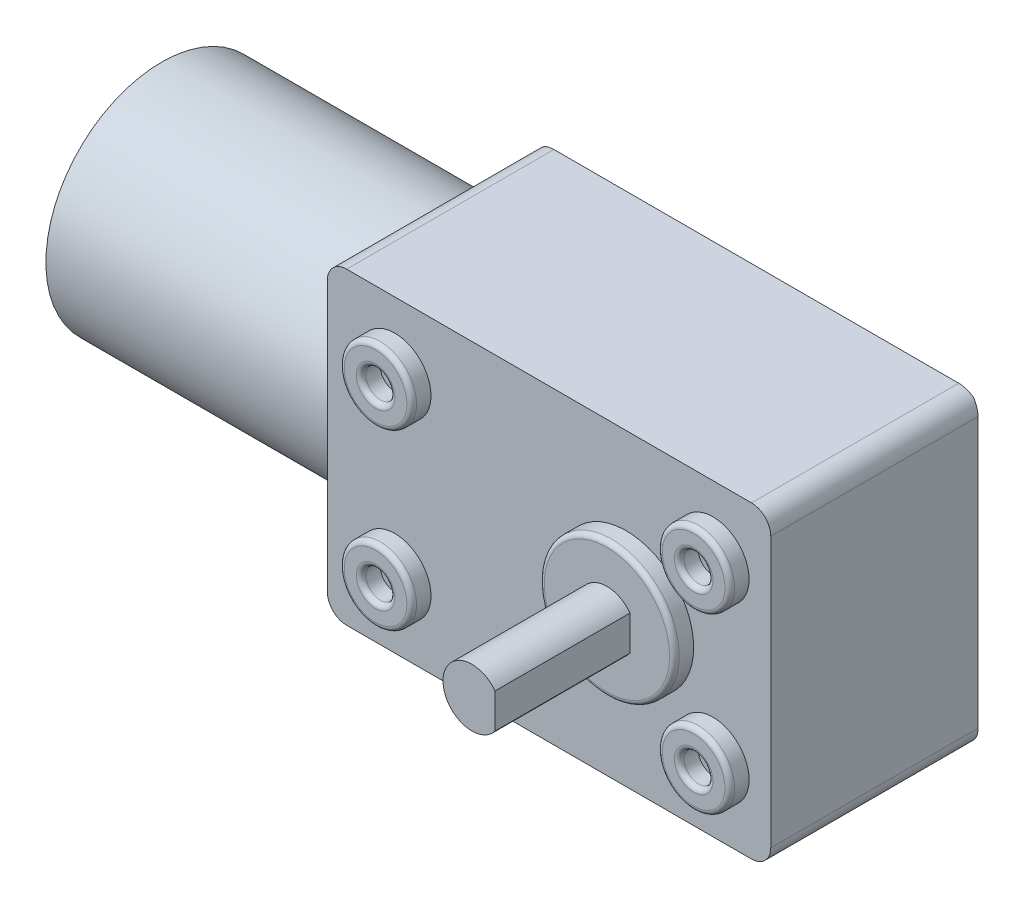
ISO-10303-21;
HEADER;
FILE_DESCRIPTION(('STEP AP214'),'2;1');
FILE_NAME('part.step','',(''),(''),'','','');
FILE_SCHEMA(('AUTOMOTIVE_DESIGN { 1 0 10303 214 1 1 1 1 }'));
ENDSEC;
DATA;
#1=APPLICATION_CONTEXT('core data for automotive mechanical design processes');
#2=APPLICATION_PROTOCOL_DEFINITION('international standard','automotive_design',2000,#1);
#3=PRODUCT_CONTEXT('',#1,'mechanical');
#4=PRODUCT('Part','Part','',(#3));
#5=PRODUCT_RELATED_PRODUCT_CATEGORY('part','',(#4));
#6=PRODUCT_DEFINITION_FORMATION('','',#4);
#7=PRODUCT_DEFINITION_CONTEXT('part definition',#1,'design');
#8=PRODUCT_DEFINITION('design','',#6,#7);
#9=PRODUCT_DEFINITION_SHAPE('','',#8);
#10=(LENGTH_UNIT() NAMED_UNIT(*) SI_UNIT(.MILLI.,.METRE.));
#11=(NAMED_UNIT(*) PLANE_ANGLE_UNIT() SI_UNIT($,.RADIAN.));
#12=(NAMED_UNIT(*) SI_UNIT($,.STERADIAN.) SOLID_ANGLE_UNIT());
#13=UNCERTAINTY_MEASURE_WITH_UNIT(LENGTH_MEASURE(1.E-05),#10,'distance_accuracy_value','');
#14=(GEOMETRIC_REPRESENTATION_CONTEXT(3) GLOBAL_UNCERTAINTY_ASSIGNED_CONTEXT((#13)) GLOBAL_UNIT_ASSIGNED_CONTEXT((#10,
#11,#12)) REPRESENTATION_CONTEXT('',''));
#15=CARTESIAN_POINT('',(0.,0.,0.));
#16=DIRECTION('',(0.,0.,1.));
#17=DIRECTION('',(1.,0.,0.));
#18=AXIS2_PLACEMENT_3D('',#15,#16,#17);
#19=CARTESIAN_POINT('',(8.,0.,24.4));
#20=DIRECTION('',(0.,0.,1.));
#21=DIRECTION('',(1.,0.,0.));
#22=AXIS2_PLACEMENT_3D('',#19,#20,#21);
#23=PLANE('',#22);
#24=CARTESIAN_POINT('',(8.,0.,24.4));
#25=DIRECTION('',(0.,0.,1.));
#26=DIRECTION('',(1.,0.,0.));
#27=AXIS2_PLACEMENT_3D('',#24,#25,#26);
#28=CIRCLE('',#27,6.5);
#29=CARTESIAN_POINT('',(14.5,0.,24.4));
#30=VERTEX_POINT('',#29);
#31=EDGE_CURVE('E234',#30,#30,#28,.T.);
#32=ORIENTED_EDGE('',*,*,#31,.T.);
#33=EDGE_LOOP('',(#32));
#34=FACE_BOUND('',#33,.T.);
#35=DIRECTION('',(0.,1.,0.));
#36=VECTOR('',#35,1.);
#37=CARTESIAN_POINT('',(10.4,1.8,24.4));
#38=LINE('',#37,#36);
#39=CARTESIAN_POINT('',(10.4,-1.8,24.4));
#40=VERTEX_POINT('',#39);
#41=CARTESIAN_POINT('',(10.4,1.8,24.4));
#42=VERTEX_POINT('',#41);
#43=EDGE_CURVE('E146',#40,#42,#38,.T.);
#44=ORIENTED_EDGE('',*,*,#43,.F.);
#45=CARTESIAN_POINT('',(8.,0.,24.4));
#46=DIRECTION('',(0.,0.,1.));
#47=DIRECTION('',(1.,0.,0.));
#48=AXIS2_PLACEMENT_3D('',#45,#46,#47);
#49=CIRCLE('',#48,3.);
#50=EDGE_CURVE('E47',#42,#40,#49,.T.);
#51=ORIENTED_EDGE('',*,*,#50,.F.);
#52=EDGE_LOOP('',(#44,#51));
#53=FACE_BOUND('',#52,.T.);
#54=ADVANCED_FACE('F32',(#34,#53),#23,.T.);
#55=CARTESIAN_POINT('',(23.,16.,22.4));
#56=DIRECTION('',(-1.,0.,0.));
#57=DIRECTION('',(0.,0.,1.));
#58=AXIS2_PLACEMENT_3D('',#55,#56,#57);
#59=PLANE('',#58);
#60=DIRECTION('',(0.,1.,0.));
#61=VECTOR('',#60,1.);
#62=CARTESIAN_POINT('',(23.,16.,22.4));
#63=LINE('',#62,#61);
#64=CARTESIAN_POINT('',(23.,-14.,22.4));
#65=VERTEX_POINT('',#64);
#66=CARTESIAN_POINT('',(23.,14.,22.4));
#67=VERTEX_POINT('',#66);
#68=EDGE_CURVE('E184',#65,#67,#63,.T.);
#69=ORIENTED_EDGE('',*,*,#68,.F.);
#70=DIRECTION('',(0.,0.,-1.));
#71=VECTOR('',#70,1.);
#72=CARTESIAN_POINT('',(23.,-14.,22.4));
#73=LINE('',#72,#71);
#74=CARTESIAN_POINT('',(23.,-14.,0.900000000000001));
#75=VERTEX_POINT('',#74);
#76=EDGE_CURVE('E291',#65,#75,#73,.T.);
#77=ORIENTED_EDGE('',*,*,#76,.T.);
#78=DIRECTION('',(0.,1.,0.));
#79=VECTOR('',#78,1.);
#80=CARTESIAN_POINT('',(23.,16.,0.900000000000001));
#81=LINE('',#80,#79);
#82=CARTESIAN_POINT('',(23.,14.,0.900000000000001));
#83=VERTEX_POINT('',#82);
#84=EDGE_CURVE('E281',#75,#83,#81,.T.);
#85=ORIENTED_EDGE('',*,*,#84,.T.);
#86=DIRECTION('',(0.,0.,-1.));
#87=VECTOR('',#86,1.);
#88=CARTESIAN_POINT('',(23.,14.,22.4));
#89=LINE('',#88,#87);
#90=EDGE_CURVE('E287',#83,#67,#89,.F.);
#91=ORIENTED_EDGE('',*,*,#90,.T.);
#92=EDGE_LOOP('',(#69,#77,#85,#91));
#93=FACE_BOUND('',#92,.T.);
#94=ADVANCED_FACE('F353',(#93),#59,.F.);
#95=CARTESIAN_POINT('',(-23.,16.,22.4));
#96=DIRECTION('',(0.,-1.,0.));
#97=DIRECTION('',(0.,0.,-1.));
#98=AXIS2_PLACEMENT_3D('',#95,#96,#97);
#99=PLANE('',#98);
#100=DIRECTION('',(-1.,0.,0.));
#101=VECTOR('',#100,1.);
#102=CARTESIAN_POINT('',(-23.,16.,22.4));
#103=LINE('',#102,#101);
#104=CARTESIAN_POINT('',(21.,16.,22.4));
#105=VERTEX_POINT('',#104);
#106=CARTESIAN_POINT('',(-21.,16.,22.4));
#107=VERTEX_POINT('',#106);
#108=EDGE_CURVE('E187',#105,#107,#103,.T.);
#109=ORIENTED_EDGE('',*,*,#108,.F.);
#110=DIRECTION('',(0.,0.,-1.));
#111=VECTOR('',#110,1.);
#112=CARTESIAN_POINT('',(21.,16.,22.4));
#113=LINE('',#112,#111);
#114=CARTESIAN_POINT('',(21.,16.,0.900000000000001));
#115=VERTEX_POINT('',#114);
#116=EDGE_CURVE('E317',#105,#115,#113,.T.);
#117=ORIENTED_EDGE('',*,*,#116,.T.);
#118=DIRECTION('',(-1.,0.,0.));
#119=VECTOR('',#118,1.);
#120=CARTESIAN_POINT('',(-23.,16.,0.900000000000001));
#121=LINE('',#120,#119);
#122=CARTESIAN_POINT('',(-21.,16.,0.900000000000001));
#123=VERTEX_POINT('',#122);
#124=EDGE_CURVE('E264',#115,#123,#121,.T.);
#125=ORIENTED_EDGE('',*,*,#124,.T.);
#126=DIRECTION('',(0.,0.,-1.));
#127=VECTOR('',#126,1.);
#128=CARTESIAN_POINT('',(-21.,16.,22.4));
#129=LINE('',#128,#127);
#130=EDGE_CURVE('E315',#123,#107,#129,.F.);
#131=ORIENTED_EDGE('',*,*,#130,.T.);
#132=EDGE_LOOP('',(#109,#117,#125,#131));
#133=FACE_BOUND('',#132,.T.);
#134=ADVANCED_FACE('F362',(#133),#99,.F.);
#135=CARTESIAN_POINT('',(-23.,16.,22.4));
#136=DIRECTION('',(1.,0.,0.));
#137=DIRECTION('',(0.,1.,0.));
#138=AXIS2_PLACEMENT_3D('',#135,#136,#137);
#139=PLANE('',#138);
#140=CARTESIAN_POINT('',(-23.,0.,9.4));
#141=DIRECTION('',(-1.,0.,0.));
#142=DIRECTION('',(0.,-1.,0.));
#143=AXIS2_PLACEMENT_3D('',#140,#141,#142);
#144=CIRCLE('',#143,12.);
#145=CARTESIAN_POINT('',(-23.,-7.45922247958861,0.));
#146=VERTEX_POINT('',#145);
#147=CARTESIAN_POINT('',(-23.,7.45922247958861,0.));
#148=VERTEX_POINT('',#147);
#149=EDGE_CURVE('E158',#146,#148,#144,.T.);
#150=ORIENTED_EDGE('',*,*,#149,.F.);
#151=DIRECTION('',(0.,-1.,0.));
#152=VECTOR('',#151,1.);
#153=CARTESIAN_POINT('',(-23.,16.,0.));
#154=LINE('',#153,#152);
#155=CARTESIAN_POINT('',(-23.,-10.9999999999999,0.));
#156=VERTEX_POINT('',#155);
#157=EDGE_CURVE('E183',#146,#156,#154,.T.);
#158=ORIENTED_EDGE('',*,*,#157,.T.);
#159=DIRECTION('',(0.,0.984183323973696,-0.177152998315262));
#160=VECTOR('',#159,1.);
#161=CARTESIAN_POINT('',(-23.,-16.,0.900000000000001));
#162=LINE('',#161,#160);
#163=CARTESIAN_POINT('',(-23.,-14.,0.540000000000008));
#164=VERTEX_POINT('',#163);
#165=EDGE_CURVE('E267',#156,#164,#162,.F.);
#166=ORIENTED_EDGE('',*,*,#165,.T.);
#167=DIRECTION('',(0.,0.,-1.));
#168=VECTOR('',#167,1.);
#169=CARTESIAN_POINT('',(-23.,-14.,22.4));
#170=LINE('',#169,#168);
#171=CARTESIAN_POINT('',(-23.,-14.,22.4));
#172=VERTEX_POINT('',#171);
#173=EDGE_CURVE('E40',#164,#172,#170,.F.);
#174=ORIENTED_EDGE('',*,*,#173,.T.);
#175=DIRECTION('',(0.,-1.,0.));
#176=VECTOR('',#175,1.);
#177=CARTESIAN_POINT('',(-23.,16.,22.4));
#178=LINE('',#177,#176);
#179=CARTESIAN_POINT('',(-23.,14.,22.4));
#180=VERTEX_POINT('',#179);
#181=EDGE_CURVE('E191',#180,#172,#178,.T.);
#182=ORIENTED_EDGE('',*,*,#181,.F.);
#183=DIRECTION('',(0.,0.,-1.));
#184=VECTOR('',#183,1.);
#185=CARTESIAN_POINT('',(-23.,14.,22.4));
#186=LINE('',#185,#184);
#187=CARTESIAN_POINT('',(-23.,14.,0.540000000000008));
#188=VERTEX_POINT('',#187);
#189=EDGE_CURVE('E11',#180,#188,#186,.T.);
#190=ORIENTED_EDGE('',*,*,#189,.T.);
#191=DIRECTION('',(0.,0.984183323973696,0.177152998315262));
#192=VECTOR('',#191,1.);
#193=CARTESIAN_POINT('',(-23.,16.,0.900000000000001));
#194=LINE('',#193,#192);
#195=CARTESIAN_POINT('',(-23.,10.9999999999999,0.));
#196=VERTEX_POINT('',#195);
#197=EDGE_CURVE('E270',#188,#196,#194,.F.);
#198=ORIENTED_EDGE('',*,*,#197,.T.);
#199=EDGE_CURVE('E188',#196,#148,#154,.T.);
#200=ORIENTED_EDGE('',*,*,#199,.T.);
#201=EDGE_LOOP('',(#150,#158,#166,#174,#182,#190,#198,#200));
#202=FACE_BOUND('',#201,.T.);
#203=ADVANCED_FACE('F327',(#202),#139,.F.);
#204=CARTESIAN_POINT('',(-23.,-16.,22.4));
#205=DIRECTION('',(0.,1.,0.));
#206=DIRECTION('',(0.,0.,1.));
#207=AXIS2_PLACEMENT_3D('',#204,#205,#206);
#208=PLANE('',#207);
#209=DIRECTION('',(1.,0.,0.));
#210=VECTOR('',#209,1.);
#211=CARTESIAN_POINT('',(-23.,-16.,0.900000000000001));
#212=LINE('',#211,#210);
#213=CARTESIAN_POINT('',(-21.,-16.,0.900000000000001));
#214=VERTEX_POINT('',#213);
#215=CARTESIAN_POINT('',(21.,-16.,0.900000000000001));
#216=VERTEX_POINT('',#215);
#217=EDGE_CURVE('E284',#214,#216,#212,.T.);
#218=ORIENTED_EDGE('',*,*,#217,.T.);
#219=DIRECTION('',(0.,0.,-1.));
#220=VECTOR('',#219,1.);
#221=CARTESIAN_POINT('',(21.,-16.,22.4));
#222=LINE('',#221,#220);
#223=CARTESIAN_POINT('',(21.,-16.,22.4));
#224=VERTEX_POINT('',#223);
#225=EDGE_CURVE('E305',#216,#224,#222,.F.);
#226=ORIENTED_EDGE('',*,*,#225,.T.);
#227=DIRECTION('',(1.,0.,0.));
#228=VECTOR('',#227,1.);
#229=CARTESIAN_POINT('',(-23.,-16.,22.4));
#230=LINE('',#229,#228);
#231=CARTESIAN_POINT('',(-21.,-16.,22.4));
#232=VERTEX_POINT('',#231);
#233=EDGE_CURVE('E194',#232,#224,#230,.T.);
#234=ORIENTED_EDGE('',*,*,#233,.F.);
#235=DIRECTION('',(0.,0.,-1.));
#236=VECTOR('',#235,1.);
#237=CARTESIAN_POINT('',(-21.,-16.,22.4));
#238=LINE('',#237,#236);
#239=EDGE_CURVE('E302',#232,#214,#238,.T.);
#240=ORIENTED_EDGE('',*,*,#239,.T.);
#241=EDGE_LOOP('',(#218,#226,#234,#240));
#242=FACE_BOUND('',#241,.T.);
#243=ADVANCED_FACE('F339',(#242),#208,.F.);
#244=CARTESIAN_POINT('',(0.,0.,22.4));
#245=DIRECTION('',(0.,0.,1.));
#246=DIRECTION('',(1.,0.,0.));
#247=AXIS2_PLACEMENT_3D('',#244,#245,#246);
#248=PLANE('',#247);
#249=CARTESIAN_POINT('',(8.,0.,22.4));
#250=DIRECTION('',(0.,0.,1.));
#251=DIRECTION('',(1.,0.,0.));
#252=AXIS2_PLACEMENT_3D('',#249,#250,#251);
#253=CIRCLE('',#252,7.);
#254=CARTESIAN_POINT('',(15.,0.,22.4));
#255=VERTEX_POINT('',#254);
#256=EDGE_CURVE('E167',#255,#255,#253,.T.);
#257=ORIENTED_EDGE('',*,*,#256,.F.);
#258=EDGE_LOOP('',(#257));
#259=FACE_BOUND('',#258,.T.);
#260=CARTESIAN_POINT('',(17.,-9.,22.4));
#261=DIRECTION('',(0.,0.,1.));
#262=DIRECTION('',(1.,0.,0.));
#263=AXIS2_PLACEMENT_3D('',#260,#261,#262);
#264=CIRCLE('',#263,3.75);
#265=CARTESIAN_POINT('',(20.75,-9.,22.4));
#266=VERTEX_POINT('',#265);
#267=EDGE_CURVE('E170',#266,#266,#264,.T.);
#268=ORIENTED_EDGE('',*,*,#267,.F.);
#269=EDGE_LOOP('',(#268));
#270=FACE_BOUND('',#269,.T.);
#271=CARTESIAN_POINT('',(17.,9.,22.4));
#272=DIRECTION('',(0.,0.,1.));
#273=DIRECTION('',(1.,0.,0.));
#274=AXIS2_PLACEMENT_3D('',#271,#272,#273);
#275=CIRCLE('',#274,3.75);
#276=CARTESIAN_POINT('',(20.75,9.,22.4));
#277=VERTEX_POINT('',#276);
#278=EDGE_CURVE('E174',#277,#277,#275,.T.);
#279=ORIENTED_EDGE('',*,*,#278,.F.);
#280=EDGE_LOOP('',(#279));
#281=FACE_BOUND('',#280,.T.);
#282=CARTESIAN_POINT('',(-16.,-9.,22.4));
#283=DIRECTION('',(0.,0.,1.));
#284=DIRECTION('',(1.,0.,0.));
#285=AXIS2_PLACEMENT_3D('',#282,#283,#284);
#286=CIRCLE('',#285,3.75);
#287=CARTESIAN_POINT('',(-12.25,-9.,22.4));
#288=VERTEX_POINT('',#287);
#289=EDGE_CURVE('E177',#288,#288,#286,.T.);
#290=ORIENTED_EDGE('',*,*,#289,.F.);
#291=EDGE_LOOP('',(#290));
#292=FACE_BOUND('',#291,.T.);
#293=CARTESIAN_POINT('',(-16.,9.,22.4));
#294=DIRECTION('',(0.,0.,1.));
#295=DIRECTION('',(1.,0.,0.));
#296=AXIS2_PLACEMENT_3D('',#293,#294,#295);
#297=CIRCLE('',#296,3.75);
#298=CARTESIAN_POINT('',(-12.25,9.,22.4));
#299=VERTEX_POINT('',#298);
#300=EDGE_CURVE('E180',#299,#299,#297,.T.);
#301=ORIENTED_EDGE('',*,*,#300,.F.);
#302=EDGE_LOOP('',(#301));
#303=FACE_BOUND('',#302,.T.);
#304=ORIENTED_EDGE('',*,*,#233,.T.);
#305=CARTESIAN_POINT('',(21.,-14.,22.4));
#306=DIRECTION('',(0.,0.,1.));
#307=DIRECTION('',(1.,0.,0.));
#308=AXIS2_PLACEMENT_3D('',#305,#306,#307);
#309=CIRCLE('',#308,2.);
#310=EDGE_CURVE('E313',#224,#65,#309,.T.);
#311=ORIENTED_EDGE('',*,*,#310,.T.);
#312=ORIENTED_EDGE('',*,*,#68,.T.);
#313=CARTESIAN_POINT('',(21.,14.,22.4));
#314=DIRECTION('',(0.,0.,1.));
#315=DIRECTION('',(1.,0.,0.));
#316=AXIS2_PLACEMENT_3D('',#313,#314,#315);
#317=CIRCLE('',#316,2.);
#318=EDGE_CURVE('E311',#67,#105,#317,.T.);
#319=ORIENTED_EDGE('',*,*,#318,.T.);
#320=ORIENTED_EDGE('',*,*,#108,.T.);
#321=CARTESIAN_POINT('',(-21.,14.,22.4));
#322=DIRECTION('',(0.,0.,1.));
#323=DIRECTION('',(1.,0.,0.));
#324=AXIS2_PLACEMENT_3D('',#321,#322,#323);
#325=CIRCLE('',#324,2.);
#326=EDGE_CURVE('E309',#107,#180,#325,.T.);
#327=ORIENTED_EDGE('',*,*,#326,.T.);
#328=ORIENTED_EDGE('',*,*,#181,.T.);
#329=CARTESIAN_POINT('',(-21.,-14.,22.4));
#330=DIRECTION('',(0.,0.,1.));
#331=DIRECTION('',(1.,0.,0.));
#332=AXIS2_PLACEMENT_3D('',#329,#330,#331);
#333=CIRCLE('',#332,2.);
#334=EDGE_CURVE('E307',#172,#232,#333,.T.);
#335=ORIENTED_EDGE('',*,*,#334,.T.);
#336=EDGE_LOOP('',(#304,#311,#312,#319,#320,#327,#328,#335));
#337=FACE_BOUND('',#336,.T.);
#338=ADVANCED_FACE('F333',(#259,#270,#281,#292,#303,#337),#248,.T.);
#339=CARTESIAN_POINT('',(0.,0.,0.));
#340=DIRECTION('',(0.,0.,1.));
#341=DIRECTION('',(1.,0.,0.));
#342=AXIS2_PLACEMENT_3D('',#339,#340,#341);
#343=PLANE('',#342);
#344=ORIENTED_EDGE('',*,*,#199,.F.);
#345=DIRECTION('',(1.,0.,0.));
#346=VECTOR('',#345,1.);
#347=CARTESIAN_POINT('',(0.,10.9999999999999,0.));
#348=LINE('',#347,#346);
#349=CARTESIAN_POINT('',(17.9999999999999,10.9999999999999,0.));
#350=VERTEX_POINT('',#349);
#351=EDGE_CURVE('E278',#196,#350,#348,.T.);
#352=ORIENTED_EDGE('',*,*,#351,.T.);
#353=DIRECTION('',(0.,-1.,0.));
#354=VECTOR('',#353,1.);
#355=CARTESIAN_POINT('',(17.9999999999999,0.,0.));
#356=LINE('',#355,#354);
#357=CARTESIAN_POINT('',(17.9999999999999,-10.9999999999999,0.));
#358=VERTEX_POINT('',#357);
#359=EDGE_CURVE('E275',#350,#358,#356,.T.);
#360=ORIENTED_EDGE('',*,*,#359,.T.);
#361=DIRECTION('',(-1.,0.,0.));
#362=VECTOR('',#361,1.);
#363=CARTESIAN_POINT('',(0.,-10.9999999999999,0.));
#364=LINE('',#363,#362);
#365=EDGE_CURVE('E272',#358,#156,#364,.T.);
#366=ORIENTED_EDGE('',*,*,#365,.T.);
#367=ORIENTED_EDGE('',*,*,#157,.F.);
#368=EDGE_CURVE('E55',#148,#146,#154,.T.);
#369=ORIENTED_EDGE('',*,*,#368,.F.);
#370=EDGE_LOOP('',(#344,#352,#360,#366,#367,#369));
#371=FACE_BOUND('',#370,.T.);
#372=ADVANCED_FACE('F373',(#371),#343,.F.);
#373=CARTESIAN_POINT('',(-16.,9.,24.4));
#374=DIRECTION('',(0.,0.,1.));
#375=DIRECTION('',(1.,0.,0.));
#376=AXIS2_PLACEMENT_3D('',#373,#374,#375);
#377=PLANE('',#376);
#378=CARTESIAN_POINT('',(-16.,9.,24.4));
#379=DIRECTION('',(0.,0.,1.));
#380=DIRECTION('',(1.,0.,0.));
#381=AXIS2_PLACEMENT_3D('',#378,#379,#380);
#382=CIRCLE('',#381,2.);
#383=CARTESIAN_POINT('',(-14.,9.,24.4));
#384=VERTEX_POINT('',#383);
#385=EDGE_CURVE('E258',#384,#384,#382,.F.);
#386=ORIENTED_EDGE('',*,*,#385,.T.);
#387=EDGE_LOOP('',(#386));
#388=FACE_BOUND('',#387,.T.);
#389=CARTESIAN_POINT('',(-16.,9.,24.4));
#390=DIRECTION('',(0.,0.,1.));
#391=DIRECTION('',(1.,0.,0.));
#392=AXIS2_PLACEMENT_3D('',#389,#390,#391);
#393=CIRCLE('',#392,3.25);
#394=CARTESIAN_POINT('',(-12.75,9.,24.4));
#395=VERTEX_POINT('',#394);
#396=EDGE_CURVE('E255',#395,#395,#393,.T.);
#397=ORIENTED_EDGE('',*,*,#396,.T.);
#398=EDGE_LOOP('',(#397));
#399=FACE_BOUND('',#398,.T.);
#400=ADVANCED_FACE('F447',(#388,#399),#377,.T.);
#401=CARTESIAN_POINT('',(-16.,9.,24.4));
#402=DIRECTION('',(0.,0.,-1.));
#403=DIRECTION('',(-1.,0.,0.));
#404=AXIS2_PLACEMENT_3D('',#401,#402,#403);
#405=CYLINDRICAL_SURFACE('',#404,3.75);
#406=CARTESIAN_POINT('',(-16.,9.,23.9));
#407=DIRECTION('',(0.,0.,1.));
#408=DIRECTION('',(1.,0.,0.));
#409=AXIS2_PLACEMENT_3D('',#406,#407,#408);
#410=CIRCLE('',#409,3.75);
#411=CARTESIAN_POINT('',(-12.25,9.,23.9));
#412=VERTEX_POINT('',#411);
#413=EDGE_CURVE('E261',#412,#412,#410,.F.);
#414=ORIENTED_EDGE('',*,*,#413,.T.);
#415=EDGE_LOOP('',(#414));
#416=FACE_BOUND('',#415,.T.);
#417=ORIENTED_EDGE('',*,*,#300,.T.);
#418=EDGE_LOOP('',(#417));
#419=FACE_BOUND('',#418,.T.);
#420=ADVANCED_FACE('F445',(#416,#419),#405,.T.);
#421=CARTESIAN_POINT('',(-16.,9.,24.4));
#422=DIRECTION('',(0.,0.,-1.));
#423=DIRECTION('',(-1.,0.,0.));
#424=AXIS2_PLACEMENT_3D('',#421,#422,#423);
#425=CYLINDRICAL_SURFACE('',#424,1.5);
#426=CARTESIAN_POINT('',(-16.,9.,23.9));
#427=DIRECTION('',(0.,0.,1.));
#428=DIRECTION('',(1.,0.,0.));
#429=AXIS2_PLACEMENT_3D('',#426,#427,#428);
#430=CIRCLE('',#429,1.5);
#431=CARTESIAN_POINT('',(-14.5,9.,23.9));
#432=VERTEX_POINT('',#431);
#433=EDGE_CURVE('E252',#432,#432,#430,.T.);
#434=ORIENTED_EDGE('',*,*,#433,.T.);
#435=EDGE_LOOP('',(#434));
#436=FACE_BOUND('',#435,.T.);
#437=CARTESIAN_POINT('',(-16.,9.,22.4));
#438=DIRECTION('',(0.,0.,1.));
#439=DIRECTION('',(1.,0.,0.));
#440=AXIS2_PLACEMENT_3D('',#437,#438,#439);
#441=CIRCLE('',#440,1.5);
#442=CARTESIAN_POINT('',(-14.5,9.,22.4));
#443=VERTEX_POINT('',#442);
#444=EDGE_CURVE('E197',#443,#443,#441,.F.);
#445=ORIENTED_EDGE('',*,*,#444,.T.);
#446=EDGE_LOOP('',(#445));
#447=FACE_BOUND('',#446,.T.);
#448=ADVANCED_FACE('F442',(#436,#447),#425,.F.);
#449=ORIENTED_EDGE('',*,*,#444,.F.);
#450=EDGE_LOOP('',(#449));
#451=FACE_BOUND('',#450,.T.);
#452=ADVANCED_FACE('F437',(#451),#248,.T.);
#453=CARTESIAN_POINT('',(-16.,-9.,24.4));
#454=DIRECTION('',(0.,0.,1.));
#455=DIRECTION('',(1.,0.,0.));
#456=AXIS2_PLACEMENT_3D('',#453,#454,#455);
#457=PLANE('',#456);
#458=CARTESIAN_POINT('',(-16.,-9.,24.4));
#459=DIRECTION('',(0.,0.,1.));
#460=DIRECTION('',(1.,0.,0.));
#461=AXIS2_PLACEMENT_3D('',#458,#459,#460);
#462=CIRCLE('',#461,2.);
#463=CARTESIAN_POINT('',(-14.,-9.,24.4));
#464=VERTEX_POINT('',#463);
#465=EDGE_CURVE('E228',#464,#464,#462,.F.);
#466=ORIENTED_EDGE('',*,*,#465,.T.);
#467=EDGE_LOOP('',(#466));
#468=FACE_BOUND('',#467,.T.);
#469=CARTESIAN_POINT('',(-16.,-9.,24.4));
#470=DIRECTION('',(0.,0.,1.));
#471=DIRECTION('',(1.,0.,0.));
#472=AXIS2_PLACEMENT_3D('',#469,#470,#471);
#473=CIRCLE('',#472,3.25);
#474=CARTESIAN_POINT('',(-12.75,-9.,24.4));
#475=VERTEX_POINT('',#474);
#476=EDGE_CURVE('E225',#475,#475,#473,.T.);
#477=ORIENTED_EDGE('',*,*,#476,.T.);
#478=EDGE_LOOP('',(#477));
#479=FACE_BOUND('',#478,.T.);
#480=ADVANCED_FACE('F434',(#468,#479),#457,.T.);
#481=CARTESIAN_POINT('',(-16.,-9.,24.4));
#482=DIRECTION('',(0.,0.,-1.));
#483=DIRECTION('',(-1.,0.,0.));
#484=AXIS2_PLACEMENT_3D('',#481,#482,#483);
#485=CYLINDRICAL_SURFACE('',#484,3.75);
#486=CARTESIAN_POINT('',(-16.,-9.,23.9));
#487=DIRECTION('',(0.,0.,1.));
#488=DIRECTION('',(1.,0.,0.));
#489=AXIS2_PLACEMENT_3D('',#486,#487,#488);
#490=CIRCLE('',#489,3.75);
#491=CARTESIAN_POINT('',(-12.25,-9.,23.9));
#492=VERTEX_POINT('',#491);
#493=EDGE_CURVE('E231',#492,#492,#490,.F.);
#494=ORIENTED_EDGE('',*,*,#493,.T.);
#495=EDGE_LOOP('',(#494));
#496=FACE_BOUND('',#495,.T.);
#497=ORIENTED_EDGE('',*,*,#289,.T.);
#498=EDGE_LOOP('',(#497));
#499=FACE_BOUND('',#498,.T.);
#500=ADVANCED_FACE('F432',(#496,#499),#485,.T.);
#501=CARTESIAN_POINT('',(-16.,-9.,24.4));
#502=DIRECTION('',(0.,0.,-1.));
#503=DIRECTION('',(-1.,0.,0.));
#504=AXIS2_PLACEMENT_3D('',#501,#502,#503);
#505=CYLINDRICAL_SURFACE('',#504,1.5);
#506=CARTESIAN_POINT('',(-16.,-9.,23.9));
#507=DIRECTION('',(0.,0.,1.));
#508=DIRECTION('',(1.,0.,0.));
#509=AXIS2_PLACEMENT_3D('',#506,#507,#508);
#510=CIRCLE('',#509,1.5);
#511=CARTESIAN_POINT('',(-14.5,-9.,23.9));
#512=VERTEX_POINT('',#511);
#513=EDGE_CURVE('E222',#512,#512,#510,.T.);
#514=ORIENTED_EDGE('',*,*,#513,.T.);
#515=EDGE_LOOP('',(#514));
#516=FACE_BOUND('',#515,.T.);
#517=CARTESIAN_POINT('',(-16.,-9.,22.4));
#518=DIRECTION('',(0.,0.,1.));
#519=DIRECTION('',(1.,0.,0.));
#520=AXIS2_PLACEMENT_3D('',#517,#518,#519);
#521=CIRCLE('',#520,1.5);
#522=CARTESIAN_POINT('',(-14.5,-9.,22.4));
#523=VERTEX_POINT('',#522);
#524=EDGE_CURVE('E201',#523,#523,#521,.F.);
#525=ORIENTED_EDGE('',*,*,#524,.T.);
#526=EDGE_LOOP('',(#525));
#527=FACE_BOUND('',#526,.T.);
#528=ADVANCED_FACE('F429',(#516,#527),#505,.F.);
#529=ORIENTED_EDGE('',*,*,#524,.F.);
#530=EDGE_LOOP('',(#529));
#531=FACE_BOUND('',#530,.T.);
#532=ADVANCED_FACE('F424',(#531),#248,.T.);
#533=CARTESIAN_POINT('',(17.,9.,24.4));
#534=DIRECTION('',(0.,0.,1.));
#535=DIRECTION('',(1.,0.,0.));
#536=AXIS2_PLACEMENT_3D('',#533,#534,#535);
#537=PLANE('',#536);
#538=CARTESIAN_POINT('',(17.,9.,24.4));
#539=DIRECTION('',(0.,0.,1.));
#540=DIRECTION('',(1.,0.,0.));
#541=AXIS2_PLACEMENT_3D('',#538,#539,#540);
#542=CIRCLE('',#541,2.);
#543=CARTESIAN_POINT('',(19.,9.,24.4));
#544=VERTEX_POINT('',#543);
#545=EDGE_CURVE('E246',#544,#544,#542,.F.);
#546=ORIENTED_EDGE('',*,*,#545,.T.);
#547=EDGE_LOOP('',(#546));
#548=FACE_BOUND('',#547,.T.);
#549=CARTESIAN_POINT('',(17.,9.,24.4));
#550=DIRECTION('',(0.,0.,1.));
#551=DIRECTION('',(1.,0.,0.));
#552=AXIS2_PLACEMENT_3D('',#549,#550,#551);
#553=CIRCLE('',#552,3.25);
#554=CARTESIAN_POINT('',(20.25,9.,24.4));
#555=VERTEX_POINT('',#554);
#556=EDGE_CURVE('E243',#555,#555,#553,.T.);
#557=ORIENTED_EDGE('',*,*,#556,.T.);
#558=EDGE_LOOP('',(#557));
#559=FACE_BOUND('',#558,.T.);
#560=ADVANCED_FACE('F421',(#548,#559),#537,.T.);
#561=CARTESIAN_POINT('',(17.,9.,24.4));
#562=DIRECTION('',(0.,0.,-1.));
#563=DIRECTION('',(-1.,0.,0.));
#564=AXIS2_PLACEMENT_3D('',#561,#562,#563);
#565=CYLINDRICAL_SURFACE('',#564,3.75);
#566=CARTESIAN_POINT('',(17.,9.,23.9));
#567=DIRECTION('',(0.,0.,1.));
#568=DIRECTION('',(1.,0.,0.));
#569=AXIS2_PLACEMENT_3D('',#566,#567,#568);
#570=CIRCLE('',#569,3.75);
#571=CARTESIAN_POINT('',(20.75,9.,23.9));
#572=VERTEX_POINT('',#571);
#573=EDGE_CURVE('E249',#572,#572,#570,.F.);
#574=ORIENTED_EDGE('',*,*,#573,.T.);
#575=EDGE_LOOP('',(#574));
#576=FACE_BOUND('',#575,.T.);
#577=ORIENTED_EDGE('',*,*,#278,.T.);
#578=EDGE_LOOP('',(#577));
#579=FACE_BOUND('',#578,.T.);
#580=ADVANCED_FACE('F419',(#576,#579),#565,.T.);
#581=CARTESIAN_POINT('',(17.,9.,24.4));
#582=DIRECTION('',(0.,0.,-1.));
#583=DIRECTION('',(-1.,0.,0.));
#584=AXIS2_PLACEMENT_3D('',#581,#582,#583);
#585=CYLINDRICAL_SURFACE('',#584,1.5);
#586=CARTESIAN_POINT('',(17.,9.,23.9));
#587=DIRECTION('',(0.,0.,1.));
#588=DIRECTION('',(1.,0.,0.));
#589=AXIS2_PLACEMENT_3D('',#586,#587,#588);
#590=CIRCLE('',#589,1.5);
#591=CARTESIAN_POINT('',(18.5,9.,23.9));
#592=VERTEX_POINT('',#591);
#593=EDGE_CURVE('E240',#592,#592,#590,.T.);
#594=ORIENTED_EDGE('',*,*,#593,.T.);
#595=EDGE_LOOP('',(#594));
#596=FACE_BOUND('',#595,.T.);
#597=CARTESIAN_POINT('',(17.,9.,22.4));
#598=DIRECTION('',(0.,0.,1.));
#599=DIRECTION('',(1.,0.,0.));
#600=AXIS2_PLACEMENT_3D('',#597,#598,#599);
#601=CIRCLE('',#600,1.5);
#602=CARTESIAN_POINT('',(18.5,9.,22.4));
#603=VERTEX_POINT('',#602);
#604=EDGE_CURVE('E204',#603,#603,#601,.F.);
#605=ORIENTED_EDGE('',*,*,#604,.T.);
#606=EDGE_LOOP('',(#605));
#607=FACE_BOUND('',#606,.T.);
#608=ADVANCED_FACE('F416',(#596,#607),#585,.F.);
#609=ORIENTED_EDGE('',*,*,#604,.F.);
#610=EDGE_LOOP('',(#609));
#611=FACE_BOUND('',#610,.T.);
#612=ADVANCED_FACE('F411',(#611),#248,.T.);
#613=CARTESIAN_POINT('',(17.,-9.,24.4));
#614=DIRECTION('',(0.,0.,1.));
#615=DIRECTION('',(1.,0.,0.));
#616=AXIS2_PLACEMENT_3D('',#613,#614,#615);
#617=PLANE('',#616);
#618=CARTESIAN_POINT('',(17.,-9.,24.4));
#619=DIRECTION('',(0.,0.,1.));
#620=DIRECTION('',(1.,0.,0.));
#621=AXIS2_PLACEMENT_3D('',#618,#619,#620);
#622=CIRCLE('',#621,2.);
#623=CARTESIAN_POINT('',(19.,-9.,24.4));
#624=VERTEX_POINT('',#623);
#625=EDGE_CURVE('E216',#624,#624,#622,.F.);
#626=ORIENTED_EDGE('',*,*,#625,.T.);
#627=EDGE_LOOP('',(#626));
#628=FACE_BOUND('',#627,.T.);
#629=CARTESIAN_POINT('',(17.,-9.,24.4));
#630=DIRECTION('',(0.,0.,1.));
#631=DIRECTION('',(1.,0.,0.));
#632=AXIS2_PLACEMENT_3D('',#629,#630,#631);
#633=CIRCLE('',#632,3.25);
#634=CARTESIAN_POINT('',(20.25,-9.,24.4));
#635=VERTEX_POINT('',#634);
#636=EDGE_CURVE('E213',#635,#635,#633,.T.);
#637=ORIENTED_EDGE('',*,*,#636,.T.);
#638=EDGE_LOOP('',(#637));
#639=FACE_BOUND('',#638,.T.);
#640=ADVANCED_FACE('F408',(#628,#639),#617,.T.);
#641=CARTESIAN_POINT('',(17.,-9.,24.4));
#642=DIRECTION('',(0.,0.,-1.));
#643=DIRECTION('',(-1.,0.,0.));
#644=AXIS2_PLACEMENT_3D('',#641,#642,#643);
#645=CYLINDRICAL_SURFACE('',#644,3.75);
#646=CARTESIAN_POINT('',(17.,-9.,23.9));
#647=DIRECTION('',(0.,0.,1.));
#648=DIRECTION('',(1.,0.,0.));
#649=AXIS2_PLACEMENT_3D('',#646,#647,#648);
#650=CIRCLE('',#649,3.75);
#651=CARTESIAN_POINT('',(20.75,-9.,23.9));
#652=VERTEX_POINT('',#651);
#653=EDGE_CURVE('E219',#652,#652,#650,.F.);
#654=ORIENTED_EDGE('',*,*,#653,.T.);
#655=EDGE_LOOP('',(#654));
#656=FACE_BOUND('',#655,.T.);
#657=ORIENTED_EDGE('',*,*,#267,.T.);
#658=EDGE_LOOP('',(#657));
#659=FACE_BOUND('',#658,.T.);
#660=ADVANCED_FACE('F406',(#656,#659),#645,.T.);
#661=CARTESIAN_POINT('',(17.,-9.,24.4));
#662=DIRECTION('',(0.,0.,-1.));
#663=DIRECTION('',(-1.,0.,0.));
#664=AXIS2_PLACEMENT_3D('',#661,#662,#663);
#665=CYLINDRICAL_SURFACE('',#664,1.5);
#666=CARTESIAN_POINT('',(17.,-9.,23.9));
#667=DIRECTION('',(0.,0.,1.));
#668=DIRECTION('',(1.,0.,0.));
#669=AXIS2_PLACEMENT_3D('',#666,#667,#668);
#670=CIRCLE('',#669,1.5);
#671=CARTESIAN_POINT('',(18.5,-9.,23.9));
#672=VERTEX_POINT('',#671);
#673=EDGE_CURVE('E210',#672,#672,#670,.T.);
#674=ORIENTED_EDGE('',*,*,#673,.T.);
#675=EDGE_LOOP('',(#674));
#676=FACE_BOUND('',#675,.T.);
#677=CARTESIAN_POINT('',(17.,-9.,22.4));
#678=DIRECTION('',(0.,0.,1.));
#679=DIRECTION('',(1.,0.,0.));
#680=AXIS2_PLACEMENT_3D('',#677,#678,#679);
#681=CIRCLE('',#680,1.5);
#682=CARTESIAN_POINT('',(18.5,-9.,22.4));
#683=VERTEX_POINT('',#682);
#684=EDGE_CURVE('E207',#683,#683,#681,.F.);
#685=ORIENTED_EDGE('',*,*,#684,.T.);
#686=EDGE_LOOP('',(#685));
#687=FACE_BOUND('',#686,.T.);
#688=ADVANCED_FACE('F403',(#676,#687),#665,.F.);
#689=ORIENTED_EDGE('',*,*,#684,.F.);
#690=EDGE_LOOP('',(#689));
#691=FACE_BOUND('',#690,.T.);
#692=ADVANCED_FACE('F401',(#691),#248,.T.);
#693=CARTESIAN_POINT('',(8.,0.,24.4));
#694=DIRECTION('',(0.,0.,-1.));
#695=DIRECTION('',(-1.,0.,0.));
#696=AXIS2_PLACEMENT_3D('',#693,#694,#695);
#697=CYLINDRICAL_SURFACE('',#696,7.);
#698=CARTESIAN_POINT('',(8.,0.,23.9));
#699=DIRECTION('',(0.,0.,1.));
#700=DIRECTION('',(1.,0.,0.));
#701=AXIS2_PLACEMENT_3D('',#698,#699,#700);
#702=CIRCLE('',#701,7.);
#703=CARTESIAN_POINT('',(15.,0.,23.9));
#704=VERTEX_POINT('',#703);
#705=EDGE_CURVE('E237',#704,#704,#702,.F.);
#706=ORIENTED_EDGE('',*,*,#705,.T.);
#707=EDGE_LOOP('',(#706));
#708=FACE_BOUND('',#707,.T.);
#709=ORIENTED_EDGE('',*,*,#256,.T.);
#710=EDGE_LOOP('',(#709));
#711=FACE_BOUND('',#710,.T.);
#712=ADVANCED_FACE('F397',(#708,#711),#697,.T.);
#713=CARTESIAN_POINT('',(17.,-9.,23.9));
#714=DIRECTION('',(0.,0.,1.));
#715=DIRECTION('',(1.,0.,0.));
#716=AXIS2_PLACEMENT_3D('',#713,#714,#715);
#717=TOROIDAL_SURFACE('',#716,2.,0.5);
#718=ORIENTED_EDGE('',*,*,#625,.F.);
#719=EDGE_LOOP('',(#718));
#720=FACE_BOUND('',#719,.T.);
#721=ORIENTED_EDGE('',*,*,#673,.F.);
#722=EDGE_LOOP('',(#721));
#723=FACE_BOUND('',#722,.T.);
#724=ADVANCED_FACE('F400',(#720,#723),#717,.T.);
#725=CARTESIAN_POINT('',(17.,-9.,23.9));
#726=DIRECTION('',(0.,0.,1.));
#727=DIRECTION('',(1.,0.,0.));
#728=AXIS2_PLACEMENT_3D('',#725,#726,#727);
#729=TOROIDAL_SURFACE('',#728,3.25,0.5);
#730=ORIENTED_EDGE('',*,*,#653,.F.);
#731=EDGE_LOOP('',(#730));
#732=FACE_BOUND('',#731,.T.);
#733=ORIENTED_EDGE('',*,*,#636,.F.);
#734=EDGE_LOOP('',(#733));
#735=FACE_BOUND('',#734,.T.);
#736=ADVANCED_FACE('F467',(#732,#735),#729,.T.);
#737=CARTESIAN_POINT('',(-16.,-9.,23.9));
#738=DIRECTION('',(0.,0.,1.));
#739=DIRECTION('',(1.,0.,0.));
#740=AXIS2_PLACEMENT_3D('',#737,#738,#739);
#741=TOROIDAL_SURFACE('',#740,2.,0.5);
#742=ORIENTED_EDGE('',*,*,#465,.F.);
#743=EDGE_LOOP('',(#742));
#744=FACE_BOUND('',#743,.T.);
#745=ORIENTED_EDGE('',*,*,#513,.F.);
#746=EDGE_LOOP('',(#745));
#747=FACE_BOUND('',#746,.T.);
#748=ADVANCED_FACE('F471',(#744,#747),#741,.T.);
#749=CARTESIAN_POINT('',(-16.,-9.,23.9));
#750=DIRECTION('',(0.,0.,1.));
#751=DIRECTION('',(1.,0.,0.));
#752=AXIS2_PLACEMENT_3D('',#749,#750,#751);
#753=TOROIDAL_SURFACE('',#752,3.25,0.5);
#754=ORIENTED_EDGE('',*,*,#493,.F.);
#755=EDGE_LOOP('',(#754));
#756=FACE_BOUND('',#755,.T.);
#757=ORIENTED_EDGE('',*,*,#476,.F.);
#758=EDGE_LOOP('',(#757));
#759=FACE_BOUND('',#758,.T.);
#760=ADVANCED_FACE('F475',(#756,#759),#753,.T.);
#761=CARTESIAN_POINT('',(8.,0.,23.9));
#762=DIRECTION('',(0.,0.,1.));
#763=DIRECTION('',(1.,0.,0.));
#764=AXIS2_PLACEMENT_3D('',#761,#762,#763);
#765=TOROIDAL_SURFACE('',#764,6.5,0.5);
#766=ORIENTED_EDGE('',*,*,#705,.F.);
#767=EDGE_LOOP('',(#766));
#768=FACE_BOUND('',#767,.T.);
#769=ORIENTED_EDGE('',*,*,#31,.F.);
#770=EDGE_LOOP('',(#769));
#771=FACE_BOUND('',#770,.T.);
#772=ADVANCED_FACE('F479',(#768,#771),#765,.T.);
#773=CARTESIAN_POINT('',(17.,9.,23.9));
#774=DIRECTION('',(0.,0.,1.));
#775=DIRECTION('',(1.,0.,0.));
#776=AXIS2_PLACEMENT_3D('',#773,#774,#775);
#777=TOROIDAL_SURFACE('',#776,2.,0.5);
#778=ORIENTED_EDGE('',*,*,#545,.F.);
#779=EDGE_LOOP('',(#778));
#780=FACE_BOUND('',#779,.T.);
#781=ORIENTED_EDGE('',*,*,#593,.F.);
#782=EDGE_LOOP('',(#781));
#783=FACE_BOUND('',#782,.T.);
#784=ADVANCED_FACE('F483',(#780,#783),#777,.T.);
#785=CARTESIAN_POINT('',(17.,9.,23.9));
#786=DIRECTION('',(0.,0.,1.));
#787=DIRECTION('',(1.,0.,0.));
#788=AXIS2_PLACEMENT_3D('',#785,#786,#787);
#789=TOROIDAL_SURFACE('',#788,3.25,0.5);
#790=ORIENTED_EDGE('',*,*,#573,.F.);
#791=EDGE_LOOP('',(#790));
#792=FACE_BOUND('',#791,.T.);
#793=ORIENTED_EDGE('',*,*,#556,.F.);
#794=EDGE_LOOP('',(#793));
#795=FACE_BOUND('',#794,.T.);
#796=ADVANCED_FACE('F487',(#792,#795),#789,.T.);
#797=CARTESIAN_POINT('',(-16.,9.,23.9));
#798=DIRECTION('',(0.,0.,1.));
#799=DIRECTION('',(1.,0.,0.));
#800=AXIS2_PLACEMENT_3D('',#797,#798,#799);
#801=TOROIDAL_SURFACE('',#800,2.,0.5);
#802=ORIENTED_EDGE('',*,*,#385,.F.);
#803=EDGE_LOOP('',(#802));
#804=FACE_BOUND('',#803,.T.);
#805=ORIENTED_EDGE('',*,*,#433,.F.);
#806=EDGE_LOOP('',(#805));
#807=FACE_BOUND('',#806,.T.);
#808=ADVANCED_FACE('F491',(#804,#807),#801,.T.);
#809=CARTESIAN_POINT('',(-16.,9.,23.9));
#810=DIRECTION('',(0.,0.,1.));
#811=DIRECTION('',(1.,0.,0.));
#812=AXIS2_PLACEMENT_3D('',#809,#810,#811);
#813=TOROIDAL_SURFACE('',#812,3.25,0.5);
#814=ORIENTED_EDGE('',*,*,#413,.F.);
#815=EDGE_LOOP('',(#814));
#816=FACE_BOUND('',#815,.T.);
#817=ORIENTED_EDGE('',*,*,#396,.F.);
#818=EDGE_LOOP('',(#817));
#819=FACE_BOUND('',#818,.T.);
#820=ADVANCED_FACE('F383',(#816,#819),#813,.T.);
#821=CARTESIAN_POINT('',(-23.,-16.,0.900000000000001));
#822=DIRECTION('',(0.,0.177152998315262,0.984183323973696));
#823=DIRECTION('',(1.,0.,0.));
#824=AXIS2_PLACEMENT_3D('',#821,#822,#823);
#825=PLANE('',#824);
#826=DIRECTION('',(0.70144787983455,-0.70144787983455,0.126260618370217));
#827=VECTOR('',#826,1.);
#828=CARTESIAN_POINT('',(0.366660106278276,6.63333989372171,-3.17400118086984));
#829=LINE('',#828,#827);
#830=CARTESIAN_POINT('',(22.4142135623731,-15.4142135623731,0.794558441227161));
#831=VERTEX_POINT('',#830);
#832=EDGE_CURVE('E171',#831,#358,#829,.F.);
#833=ORIENTED_EDGE('',*,*,#832,.F.);
#834=CARTESIAN_POINT('',(21.,-14.,0.540000000000009));
#835=DIRECTION('',(0.,0.177152998315262,0.984183323973696));
#836=DIRECTION('',(0.,0.984183323973696,-0.177152998315262));
#837=AXIS2_PLACEMENT_3D('',#834,#835,#836);
#838=ELLIPSE('',#837,2.03214172734089,2.);
#839=EDGE_CURVE('E300',#831,#216,#838,.F.);
#840=ORIENTED_EDGE('',*,*,#839,.T.);
#841=ORIENTED_EDGE('',*,*,#217,.F.);
#842=CARTESIAN_POINT('',(-21.,-14.,0.540000000000009));
#843=DIRECTION('',(0.,0.177152998315262,0.984183323973696));
#844=DIRECTION('',(0.,0.984183323973696,-0.177152998315262));
#845=AXIS2_PLACEMENT_3D('',#842,#843,#844);
#846=ELLIPSE('',#845,2.03214172734089,2.);
#847=EDGE_CURVE('E298',#214,#164,#846,.F.);
#848=ORIENTED_EDGE('',*,*,#847,.T.);
#849=ORIENTED_EDGE('',*,*,#165,.F.);
#850=ORIENTED_EDGE('',*,*,#365,.F.);
#851=EDGE_LOOP('',(#833,#840,#841,#848,#849,#850));
#852=FACE_BOUND('',#851,.T.);
#853=ADVANCED_FACE('F343',(#852),#825,.F.);
#854=CARTESIAN_POINT('',(23.,16.,0.900000000000001));
#855=DIRECTION('',(-0.177152998315262,0.,0.984183323973696));
#856=DIRECTION('',(0.,1.,0.));
#857=AXIS2_PLACEMENT_3D('',#854,#855,#856);
#858=PLANE('',#857);
#859=ORIENTED_EDGE('',*,*,#84,.F.);
#860=CARTESIAN_POINT('',(21.,-14.,0.540000000000009));
#861=DIRECTION('',(-0.177152998315262,0.,0.984183323973696));
#862=DIRECTION('',(-0.984183323973696,0.,-0.177152998315262));
#863=AXIS2_PLACEMENT_3D('',#860,#861,#862);
#864=ELLIPSE('',#863,2.03214172734089,2.);
#865=EDGE_CURVE('E296',#75,#831,#864,.F.);
#866=ORIENTED_EDGE('',*,*,#865,.T.);
#867=ORIENTED_EDGE('',*,*,#832,.T.);
#868=ORIENTED_EDGE('',*,*,#359,.F.);
#869=DIRECTION('',(0.70144787983455,0.70144787983455,0.126260618370217));
#870=VECTOR('',#869,1.);
#871=CARTESIAN_POINT('',(23.,16.,0.900000000000001));
#872=LINE('',#871,#870);
#873=CARTESIAN_POINT('',(22.4142135623731,15.4142135623731,0.794558441227161));
#874=VERTEX_POINT('',#873);
#875=EDGE_CURVE('E163',#874,#350,#872,.F.);
#876=ORIENTED_EDGE('',*,*,#875,.F.);
#877=CARTESIAN_POINT('',(21.,14.,0.540000000000009));
#878=DIRECTION('',(-0.177152998315262,0.,0.984183323973696));
#879=DIRECTION('',(-0.984183323973696,0.,-0.177152998315262));
#880=AXIS2_PLACEMENT_3D('',#877,#878,#879);
#881=ELLIPSE('',#880,2.03214172734089,2.);
#882=EDGE_CURVE('E294',#874,#83,#881,.F.);
#883=ORIENTED_EDGE('',*,*,#882,.T.);
#884=EDGE_LOOP('',(#859,#866,#867,#868,#876,#883));
#885=FACE_BOUND('',#884,.T.);
#886=ADVANCED_FACE('F375',(#885),#858,.F.);
#887=CARTESIAN_POINT('',(-23.,16.,0.900000000000001));
#888=DIRECTION('',(0.,-0.177152998315262,0.984183323973696));
#889=DIRECTION('',(-1.,0.,0.));
#890=AXIS2_PLACEMENT_3D('',#887,#888,#889);
#891=PLANE('',#890);
#892=ORIENTED_EDGE('',*,*,#124,.F.);
#893=CARTESIAN_POINT('',(21.,14.,0.540000000000009));
#894=DIRECTION('',(0.,-0.177152998315262,0.984183323973696));
#895=DIRECTION('',(0.,-0.984183323973696,-0.177152998315262));
#896=AXIS2_PLACEMENT_3D('',#893,#894,#895);
#897=ELLIPSE('',#896,2.03214172734089,2.);
#898=EDGE_CURVE('E322',#115,#874,#897,.F.);
#899=ORIENTED_EDGE('',*,*,#898,.T.);
#900=ORIENTED_EDGE('',*,*,#875,.T.);
#901=ORIENTED_EDGE('',*,*,#351,.F.);
#902=ORIENTED_EDGE('',*,*,#197,.F.);
#903=CARTESIAN_POINT('',(-21.,14.,0.540000000000009));
#904=DIRECTION('',(0.,-0.177152998315262,0.984183323973696));
#905=DIRECTION('',(0.,-0.984183323973696,-0.177152998315262));
#906=AXIS2_PLACEMENT_3D('',#903,#904,#905);
#907=ELLIPSE('',#906,2.03214172734089,2.);
#908=EDGE_CURVE('E320',#188,#123,#907,.F.);
#909=ORIENTED_EDGE('',*,*,#908,.T.);
#910=EDGE_LOOP('',(#892,#899,#900,#901,#902,#909));
#911=FACE_BOUND('',#910,.T.);
#912=ADVANCED_FACE('F370',(#911),#891,.F.);
#913=CARTESIAN_POINT('',(21.,-14.,22.4));
#914=DIRECTION('',(0.,0.,-1.));
#915=DIRECTION('',(-1.,0.,0.));
#916=AXIS2_PLACEMENT_3D('',#913,#914,#915);
#917=CYLINDRICAL_SURFACE('',#916,2.);
#918=ORIENTED_EDGE('',*,*,#310,.F.);
#919=ORIENTED_EDGE('',*,*,#225,.F.);
#920=ORIENTED_EDGE('',*,*,#839,.F.);
#921=ORIENTED_EDGE('',*,*,#865,.F.);
#922=ORIENTED_EDGE('',*,*,#76,.F.);
#923=EDGE_LOOP('',(#918,#919,#920,#921,#922));
#924=FACE_BOUND('',#923,.T.);
#925=ADVANCED_FACE('F348',(#924),#917,.T.);
#926=CARTESIAN_POINT('',(21.,14.,22.4));
#927=DIRECTION('',(0.,0.,-1.));
#928=DIRECTION('',(-1.,0.,0.));
#929=AXIS2_PLACEMENT_3D('',#926,#927,#928);
#930=CYLINDRICAL_SURFACE('',#929,2.);
#931=ORIENTED_EDGE('',*,*,#318,.F.);
#932=ORIENTED_EDGE('',*,*,#90,.F.);
#933=ORIENTED_EDGE('',*,*,#882,.F.);
#934=ORIENTED_EDGE('',*,*,#898,.F.);
#935=ORIENTED_EDGE('',*,*,#116,.F.);
#936=EDGE_LOOP('',(#931,#932,#933,#934,#935));
#937=FACE_BOUND('',#936,.T.);
#938=ADVANCED_FACE('F358',(#937),#930,.T.);
#939=CARTESIAN_POINT('',(-21.,14.,22.4));
#940=DIRECTION('',(0.,0.,-1.));
#941=DIRECTION('',(-1.,0.,0.));
#942=AXIS2_PLACEMENT_3D('',#939,#940,#941);
#943=CYLINDRICAL_SURFACE('',#942,2.);
#944=ORIENTED_EDGE('',*,*,#326,.F.);
#945=ORIENTED_EDGE('',*,*,#130,.F.);
#946=ORIENTED_EDGE('',*,*,#908,.F.);
#947=ORIENTED_EDGE('',*,*,#189,.F.);
#948=EDGE_LOOP('',(#944,#945,#946,#947));
#949=FACE_BOUND('',#948,.T.);
#950=ADVANCED_FACE('F366',(#949),#943,.T.);
#951=CARTESIAN_POINT('',(-21.,-14.,22.4));
#952=DIRECTION('',(0.,0.,-1.));
#953=DIRECTION('',(-1.,0.,0.));
#954=AXIS2_PLACEMENT_3D('',#951,#952,#953);
#955=CYLINDRICAL_SURFACE('',#954,2.);
#956=ORIENTED_EDGE('',*,*,#334,.F.);
#957=ORIENTED_EDGE('',*,*,#173,.F.);
#958=ORIENTED_EDGE('',*,*,#847,.F.);
#959=ORIENTED_EDGE('',*,*,#239,.F.);
#960=EDGE_LOOP('',(#956,#957,#958,#959));
#961=FACE_BOUND('',#960,.T.);
#962=ADVANCED_FACE('F34',(#961),#955,.T.);
#963=CARTESIAN_POINT('',(-23.,0.,9.4));
#964=DIRECTION('',(-1.,0.,0.));
#965=DIRECTION('',(0.,-1.,0.));
#966=AXIS2_PLACEMENT_3D('',#963,#964,#965);
#967=PLANE('',#966);
#968=EDGE_CURVE('E164',#148,#146,#144,.T.);
#969=ORIENTED_EDGE('',*,*,#968,.F.);
#970=ORIENTED_EDGE('',*,*,#368,.T.);
#971=EDGE_LOOP('',(#969,#970));
#972=FACE_BOUND('',#971,.T.);
#973=ADVANCED_FACE('F560',(#972),#967,.F.);
#974=CARTESIAN_POINT('',(-53.2,0.,9.4));
#975=DIRECTION('',(1.,0.,0.));
#976=DIRECTION('',(0.,1.,0.));
#977=AXIS2_PLACEMENT_3D('',#974,#975,#976);
#978=CYLINDRICAL_SURFACE('',#977,12.);
#979=CARTESIAN_POINT('',(-53.2,0.,9.4));
#980=DIRECTION('',(-1.,0.,0.));
#981=DIRECTION('',(0.,-1.,0.));
#982=AXIS2_PLACEMENT_3D('',#979,#980,#981);
#983=CIRCLE('',#982,12.);
#984=CARTESIAN_POINT('',(-53.2,-12.,9.4));
#985=VERTEX_POINT('',#984);
#986=EDGE_CURVE('E160',#985,#985,#983,.T.);
#987=ORIENTED_EDGE('',*,*,#986,.F.);
#988=EDGE_LOOP('',(#987));
#989=FACE_BOUND('',#988,.T.);
#990=ORIENTED_EDGE('',*,*,#968,.T.);
#991=ORIENTED_EDGE('',*,*,#149,.T.);
#992=EDGE_LOOP('',(#990,#991));
#993=FACE_BOUND('',#992,.T.);
#994=ADVANCED_FACE('F395',(#989,#993),#978,.T.);
#995=CARTESIAN_POINT('',(-53.2,0.,9.4));
#996=DIRECTION('',(-1.,0.,0.));
#997=DIRECTION('',(0.,-1.,0.));
#998=AXIS2_PLACEMENT_3D('',#995,#996,#997);
#999=PLANE('',#998);
#1000=CARTESIAN_POINT('',(-53.2,0.,9.81722922067263));
#1001=DIRECTION('',(-1.,0.,0.));
#1002=DIRECTION('',(0.,-1.,0.));
#1003=AXIS2_PLACEMENT_3D('',#1000,#1001,#1002);
#1004=CIRCLE('',#1003,11.5);
#1005=CARTESIAN_POINT('',(-53.2,-11.5,9.81722922067263));
#1006=VERTEX_POINT('',#1005);
#1007=EDGE_CURVE('E149',#1006,#1006,#1004,.T.);
#1008=ORIENTED_EDGE('',*,*,#1007,.F.);
#1009=EDGE_LOOP('',(#1008));
#1010=FACE_BOUND('',#1009,.T.);
#1011=ORIENTED_EDGE('',*,*,#986,.T.);
#1012=EDGE_LOOP('',(#1011));
#1013=FACE_BOUND('',#1012,.T.);
#1014=ADVANCED_FACE('F591',(#1010,#1013),#999,.T.);
#1015=CARTESIAN_POINT('',(-52.2,0.,9.81722922067263));
#1016=DIRECTION('',(-1.,0.,0.));
#1017=DIRECTION('',(0.,-1.,0.));
#1018=AXIS2_PLACEMENT_3D('',#1015,#1016,#1017);
#1019=CYLINDRICAL_SURFACE('',#1018,11.5);
#1020=CARTESIAN_POINT('',(-52.2,0.,9.81722922067263));
#1021=DIRECTION('',(-1.,0.,0.));
#1022=DIRECTION('',(0.,-1.,0.));
#1023=AXIS2_PLACEMENT_3D('',#1020,#1021,#1022);
#1024=CIRCLE('',#1023,11.5);
#1025=CARTESIAN_POINT('',(-52.2,-11.5,9.81722922067263));
#1026=VERTEX_POINT('',#1025);
#1027=EDGE_CURVE('E152',#1026,#1026,#1024,.T.);
#1028=ORIENTED_EDGE('',*,*,#1027,.F.);
#1029=EDGE_LOOP('',(#1028));
#1030=FACE_BOUND('',#1029,.T.);
#1031=ORIENTED_EDGE('',*,*,#1007,.T.);
#1032=EDGE_LOOP('',(#1031));
#1033=FACE_BOUND('',#1032,.T.);
#1034=ADVANCED_FACE('F600',(#1030,#1033),#1019,.F.);
#1035=CARTESIAN_POINT('',(-52.2,0.,9.81722922067263));
#1036=DIRECTION('',(-1.,0.,0.));
#1037=DIRECTION('',(0.,-1.,0.));
#1038=AXIS2_PLACEMENT_3D('',#1035,#1036,#1037);
#1039=PLANE('',#1038);
#1040=ORIENTED_EDGE('',*,*,#1027,.T.);
#1041=EDGE_LOOP('',(#1040));
#1042=FACE_BOUND('',#1041,.T.);
#1043=ADVANCED_FACE('F610',(#1042),#1039,.T.);
#1044=CARTESIAN_POINT('',(8.,0.,38.4));
#1045=DIRECTION('',(0.,0.,-1.));
#1046=DIRECTION('',(-1.,0.,0.));
#1047=AXIS2_PLACEMENT_3D('',#1044,#1045,#1046);
#1048=CYLINDRICAL_SURFACE('',#1047,3.);
#1049=ORIENTED_EDGE('',*,*,#50,.T.);
#1050=DIRECTION('',(0.,0.,-1.));
#1051=VECTOR('',#1050,1.);
#1052=CARTESIAN_POINT('',(10.4,-1.8,38.4));
#1053=LINE('',#1052,#1051);
#1054=CARTESIAN_POINT('',(10.4,-1.8,38.4));
#1055=VERTEX_POINT('',#1054);
#1056=EDGE_CURVE('E138',#1055,#40,#1053,.T.);
#1057=ORIENTED_EDGE('',*,*,#1056,.F.);
#1058=CARTESIAN_POINT('',(8.,0.,38.4));
#1059=DIRECTION('',(0.,0.,1.));
#1060=DIRECTION('',(1.,0.,0.));
#1061=AXIS2_PLACEMENT_3D('',#1058,#1059,#1060);
#1062=CIRCLE('',#1061,3.);
#1063=CARTESIAN_POINT('',(10.4,1.8,38.4));
#1064=VERTEX_POINT('',#1063);
#1065=EDGE_CURVE('E143',#1064,#1055,#1062,.T.);
#1066=ORIENTED_EDGE('',*,*,#1065,.F.);
#1067=DIRECTION('',(0.,0.,-1.));
#1068=VECTOR('',#1067,1.);
#1069=CARTESIAN_POINT('',(10.4,1.8,38.4));
#1070=LINE('',#1069,#1068);
#1071=EDGE_CURVE('E140',#1064,#42,#1070,.T.);
#1072=ORIENTED_EDGE('',*,*,#1071,.T.);
#1073=EDGE_LOOP('',(#1049,#1057,#1066,#1072));
#1074=FACE_BOUND('',#1073,.T.);
#1075=ADVANCED_FACE('F148',(#1074),#1048,.T.);
#1076=CARTESIAN_POINT('',(10.4,1.8,38.4));
#1077=DIRECTION('',(-1.,0.,0.));
#1078=DIRECTION('',(0.,0.,1.));
#1079=AXIS2_PLACEMENT_3D('',#1076,#1077,#1078);
#1080=PLANE('',#1079);
#1081=ORIENTED_EDGE('',*,*,#43,.T.);
#1082=ORIENTED_EDGE('',*,*,#1071,.F.);
#1083=DIRECTION('',(0.,1.,0.));
#1084=VECTOR('',#1083,1.);
#1085=CARTESIAN_POINT('',(10.4,1.8,38.4));
#1086=LINE('',#1085,#1084);
#1087=EDGE_CURVE('E135',#1055,#1064,#1086,.T.);
#1088=ORIENTED_EDGE('',*,*,#1087,.F.);
#1089=ORIENTED_EDGE('',*,*,#1056,.T.);
#1090=EDGE_LOOP('',(#1081,#1082,#1088,#1089));
#1091=FACE_BOUND('',#1090,.T.);
#1092=ADVANCED_FACE('F137',(#1091),#1080,.F.);
#1093=CARTESIAN_POINT('',(8.,0.,38.4));
#1094=DIRECTION('',(0.,0.,1.));
#1095=DIRECTION('',(1.,0.,0.));
#1096=AXIS2_PLACEMENT_3D('',#1093,#1094,#1095);
#1097=PLANE('',#1096);
#1098=ORIENTED_EDGE('',*,*,#1065,.T.);
#1099=ORIENTED_EDGE('',*,*,#1087,.T.);
#1100=EDGE_LOOP('',(#1098,#1099));
#1101=FACE_BOUND('',#1100,.T.);
#1102=ADVANCED_FACE('F145',(#1101),#1097,.T.);
#1103=CLOSED_SHELL('',(#54,#94,#134,#203,#243,#338,#372,#400,#420,#448,#452,#480,#500,#528,#532,
#560,#580,#608,#612,#640,#660,#688,#692,#712,#724,#736,#748,#760,#772,#784,#796,#808,#820,#853,
#886,#912,#925,#938,#950,#962,#973,#994,#1014,#1034,#1043,#1075,#1092,#1102));
#1104=MANIFOLD_SOLID_BREP('B2',#1103);
#1105=ADVANCED_BREP_SHAPE_REPRESENTATION('',(#18,#1104),#14);
#1106=SHAPE_DEFINITION_REPRESENTATION(#9,#1105);
ENDSEC;
END-ISO-10303-21;
